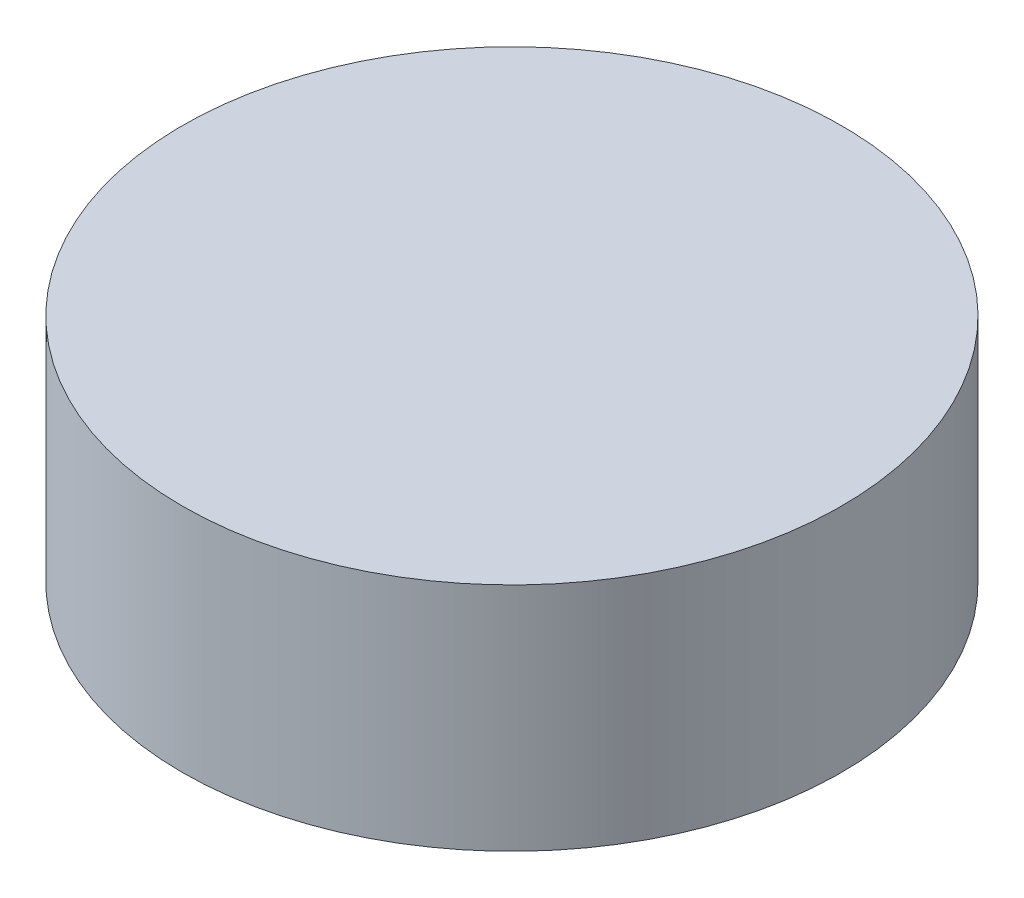
ISO-10303-21;
HEADER;
FILE_DESCRIPTION(('STEP AP214'),'2;1');
FILE_NAME('part.step','',(''),(''),'','','');
FILE_SCHEMA(('AUTOMOTIVE_DESIGN { 1 0 10303 214 1 1 1 1 }'));
ENDSEC;
DATA;
#1=APPLICATION_CONTEXT('core data for automotive mechanical design processes');
#2=APPLICATION_PROTOCOL_DEFINITION('international standard','automotive_design',2000,#1);
#3=PRODUCT_CONTEXT('',#1,'mechanical');
#4=PRODUCT('Part','Part','',(#3));
#5=PRODUCT_RELATED_PRODUCT_CATEGORY('part','',(#4));
#6=PRODUCT_DEFINITION_FORMATION('','',#4);
#7=PRODUCT_DEFINITION_CONTEXT('part definition',#1,'design');
#8=PRODUCT_DEFINITION('design','',#6,#7);
#9=PRODUCT_DEFINITION_SHAPE('','',#8);
#10=(LENGTH_UNIT() NAMED_UNIT(*) SI_UNIT(.MILLI.,.METRE.));
#11=(NAMED_UNIT(*) PLANE_ANGLE_UNIT() SI_UNIT($,.RADIAN.));
#12=(NAMED_UNIT(*) SI_UNIT($,.STERADIAN.) SOLID_ANGLE_UNIT());
#13=UNCERTAINTY_MEASURE_WITH_UNIT(LENGTH_MEASURE(1.E-05),#10,'distance_accuracy_value','');
#14=(GEOMETRIC_REPRESENTATION_CONTEXT(3) GLOBAL_UNCERTAINTY_ASSIGNED_CONTEXT((#13)) GLOBAL_UNIT_ASSIGNED_CONTEXT((#10,
#11,#12)) REPRESENTATION_CONTEXT('',''));
#15=CARTESIAN_POINT('',(0.,0.,0.));
#16=DIRECTION('',(0.,0.,1.));
#17=DIRECTION('',(1.,0.,0.));
#18=AXIS2_PLACEMENT_3D('',#15,#16,#17);
#19=CARTESIAN_POINT('',(0.,7.,0.));
#20=DIRECTION('',(0.,-1.,0.));
#21=DIRECTION('',(0.,0.,-1.));
#22=AXIS2_PLACEMENT_3D('',#19,#20,#21);
#23=CYLINDRICAL_SURFACE('',#22,10.);
#24=CARTESIAN_POINT('',(0.,7.,0.));
#25=DIRECTION('',(0.,1.,0.));
#26=DIRECTION('',(0.,0.,1.));
#27=AXIS2_PLACEMENT_3D('',#24,#25,#26);
#28=CIRCLE('',#27,10.);
#29=CARTESIAN_POINT('',(0.,7.,10.));
#30=VERTEX_POINT('',#29);
#31=EDGE_CURVE('E10',#30,#30,#28,.T.);
#32=ORIENTED_EDGE('',*,*,#31,.F.);
#33=EDGE_LOOP('',(#32));
#34=FACE_BOUND('',#33,.T.);
#35=CARTESIAN_POINT('',(0.,0.,0.));
#36=DIRECTION('',(0.,1.,0.));
#37=DIRECTION('',(0.,0.,1.));
#38=AXIS2_PLACEMENT_3D('',#35,#36,#37);
#39=CIRCLE('',#38,10.);
#40=CARTESIAN_POINT('',(0.,0.,10.));
#41=VERTEX_POINT('',#40);
#42=EDGE_CURVE('E40',#41,#41,#39,.T.);
#43=ORIENTED_EDGE('',*,*,#42,.T.);
#44=EDGE_LOOP('',(#43));
#45=FACE_BOUND('',#44,.T.);
#46=ADVANCED_FACE('F37',(#34,#45),#23,.T.);
#47=CARTESIAN_POINT('',(0.,7.,0.));
#48=DIRECTION('',(0.,1.,0.));
#49=DIRECTION('',(0.,0.,1.));
#50=AXIS2_PLACEMENT_3D('',#47,#48,#49);
#51=PLANE('',#50);
#52=ORIENTED_EDGE('',*,*,#31,.T.);
#53=EDGE_LOOP('',(#52));
#54=FACE_BOUND('',#53,.T.);
#55=ADVANCED_FACE('F54',(#54),#51,.T.);
#56=CARTESIAN_POINT('',(0.,0.,0.));
#57=DIRECTION('',(0.,1.,0.));
#58=DIRECTION('',(0.,0.,1.));
#59=AXIS2_PLACEMENT_3D('',#56,#57,#58);
#60=PLANE('',#59);
#61=ORIENTED_EDGE('',*,*,#42,.F.);
#62=EDGE_LOOP('',(#61));
#63=FACE_BOUND('',#62,.T.);
#64=ADVANCED_FACE('F52',(#63),#60,.F.);
#65=CLOSED_SHELL('',(#46,#55,#64));
#66=MANIFOLD_SOLID_BREP('B2',#65);
#67=ADVANCED_BREP_SHAPE_REPRESENTATION('',(#18,#66),#14);
#68=SHAPE_DEFINITION_REPRESENTATION(#9,#67);
ENDSEC;
END-ISO-10303-21;
